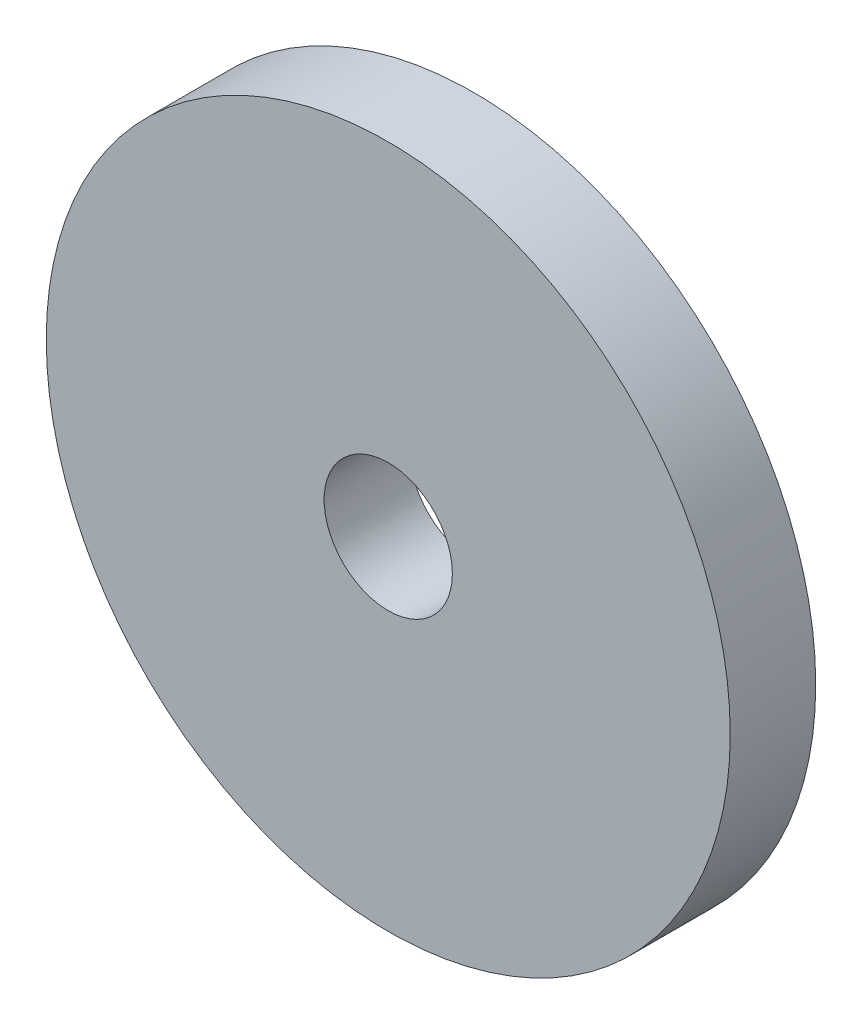
ISO-10303-21;
HEADER;
FILE_DESCRIPTION(('STEP AP214'),'2;1');
FILE_NAME('part.step','',(''),(''),'','','');
FILE_SCHEMA(('AUTOMOTIVE_DESIGN { 1 0 10303 214 1 1 1 1 }'));
ENDSEC;
DATA;
#1=APPLICATION_CONTEXT('core data for automotive mechanical design processes');
#2=APPLICATION_PROTOCOL_DEFINITION('international standard','automotive_design',2000,#1);
#3=PRODUCT_CONTEXT('',#1,'mechanical');
#4=PRODUCT('Part','Part','',(#3));
#5=PRODUCT_RELATED_PRODUCT_CATEGORY('part','',(#4));
#6=PRODUCT_DEFINITION_FORMATION('','',#4);
#7=PRODUCT_DEFINITION_CONTEXT('part definition',#1,'design');
#8=PRODUCT_DEFINITION('design','',#6,#7);
#9=PRODUCT_DEFINITION_SHAPE('','',#8);
#10=(LENGTH_UNIT() NAMED_UNIT(*) SI_UNIT(.MILLI.,.METRE.));
#11=(NAMED_UNIT(*) PLANE_ANGLE_UNIT() SI_UNIT($,.RADIAN.));
#12=(NAMED_UNIT(*) SI_UNIT($,.STERADIAN.) SOLID_ANGLE_UNIT());
#13=UNCERTAINTY_MEASURE_WITH_UNIT(LENGTH_MEASURE(1.E-05),#10,'distance_accuracy_value','');
#14=(GEOMETRIC_REPRESENTATION_CONTEXT(3) GLOBAL_UNCERTAINTY_ASSIGNED_CONTEXT((#13)) GLOBAL_UNIT_ASSIGNED_CONTEXT((#10,
#11,#12)) REPRESENTATION_CONTEXT('',''));
#15=CARTESIAN_POINT('',(0.,0.,0.));
#16=DIRECTION('',(0.,0.,1.));
#17=DIRECTION('',(1.,0.,0.));
#18=AXIS2_PLACEMENT_3D('',#15,#16,#17);
#19=CARTESIAN_POINT('',(0.,0.,-1.));
#20=DIRECTION('',(0.,0.,1.));
#21=DIRECTION('',(1.,0.,0.));
#22=AXIS2_PLACEMENT_3D('',#19,#20,#21);
#23=CYLINDRICAL_SURFACE('',#22,2.25);
#24=CARTESIAN_POINT('',(0.,0.,3.));
#25=DIRECTION('',(0.,0.,1.));
#26=DIRECTION('',(1.,0.,0.));
#27=AXIS2_PLACEMENT_3D('',#24,#25,#26);
#28=CIRCLE('',#27,2.25);
#29=CARTESIAN_POINT('',(2.25,0.,3.));
#30=VERTEX_POINT('',#29);
#31=EDGE_CURVE('E15',#30,#30,#28,.T.);
#32=ORIENTED_EDGE('',*,*,#31,.T.);
#33=EDGE_LOOP('',(#32));
#34=FACE_BOUND('',#33,.T.);
#35=CARTESIAN_POINT('',(0.,0.,0.));
#36=DIRECTION('',(0.,0.,1.));
#37=DIRECTION('',(1.,0.,0.));
#38=AXIS2_PLACEMENT_3D('',#35,#36,#37);
#39=CIRCLE('',#38,2.25);
#40=CARTESIAN_POINT('',(2.25,0.,0.));
#41=VERTEX_POINT('',#40);
#42=EDGE_CURVE('E8',#41,#41,#39,.T.);
#43=ORIENTED_EDGE('',*,*,#42,.F.);
#44=EDGE_LOOP('',(#43));
#45=FACE_BOUND('',#44,.T.);
#46=ADVANCED_FACE('F12',(#34,#45),#23,.F.);
#47=CARTESIAN_POINT('',(0.,0.,0.));
#48=DIRECTION('',(0.,0.,1.));
#49=DIRECTION('',(1.,0.,0.));
#50=AXIS2_PLACEMENT_3D('',#47,#48,#49);
#51=PLANE('',#50);
#52=ORIENTED_EDGE('',*,*,#42,.T.);
#53=EDGE_LOOP('',(#52));
#54=FACE_BOUND('',#53,.T.);
#55=CARTESIAN_POINT('',(0.,0.,0.));
#56=DIRECTION('',(0.,0.,1.));
#57=DIRECTION('',(1.,0.,0.));
#58=AXIS2_PLACEMENT_3D('',#55,#56,#57);
#59=CIRCLE('',#58,12.);
#60=CARTESIAN_POINT('',(12.,0.,0.));
#61=VERTEX_POINT('',#60);
#62=EDGE_CURVE('E28',#61,#61,#59,.T.);
#63=ORIENTED_EDGE('',*,*,#62,.F.);
#64=EDGE_LOOP('',(#63));
#65=FACE_BOUND('',#64,.T.);
#66=ADVANCED_FACE('F39',(#54,#65),#51,.F.);
#67=CARTESIAN_POINT('',(0.,0.,3.));
#68=DIRECTION('',(0.,0.,1.));
#69=DIRECTION('',(1.,0.,0.));
#70=AXIS2_PLACEMENT_3D('',#67,#68,#69);
#71=PLANE('',#70);
#72=ORIENTED_EDGE('',*,*,#31,.F.);
#73=EDGE_LOOP('',(#72));
#74=FACE_BOUND('',#73,.T.);
#75=CARTESIAN_POINT('',(0.,0.,3.));
#76=DIRECTION('',(0.,0.,1.));
#77=DIRECTION('',(1.,0.,0.));
#78=AXIS2_PLACEMENT_3D('',#75,#76,#77);
#79=CIRCLE('',#78,12.);
#80=CARTESIAN_POINT('',(12.,0.,3.));
#81=VERTEX_POINT('',#80);
#82=EDGE_CURVE('E30',#81,#81,#79,.T.);
#83=ORIENTED_EDGE('',*,*,#82,.T.);
#84=EDGE_LOOP('',(#83));
#85=FACE_BOUND('',#84,.T.);
#86=ADVANCED_FACE('F41',(#74,#85),#71,.T.);
#87=CARTESIAN_POINT('',(0.,0.,0.));
#88=DIRECTION('',(0.,0.,1.));
#89=DIRECTION('',(1.,0.,0.));
#90=AXIS2_PLACEMENT_3D('',#87,#88,#89);
#91=CYLINDRICAL_SURFACE('',#90,12.);
#92=ORIENTED_EDGE('',*,*,#82,.F.);
#93=EDGE_LOOP('',(#92));
#94=FACE_BOUND('',#93,.T.);
#95=ORIENTED_EDGE('',*,*,#62,.T.);
#96=EDGE_LOOP('',(#95));
#97=FACE_BOUND('',#96,.T.);
#98=ADVANCED_FACE('F37',(#94,#97),#91,.T.);
#99=CLOSED_SHELL('',(#46,#66,#86,#98));
#100=MANIFOLD_SOLID_BREP('B1',#99);
#101=ADVANCED_BREP_SHAPE_REPRESENTATION('',(#18,#100),#14);
#102=SHAPE_DEFINITION_REPRESENTATION(#9,#101);
ENDSEC;
END-ISO-10303-21;
